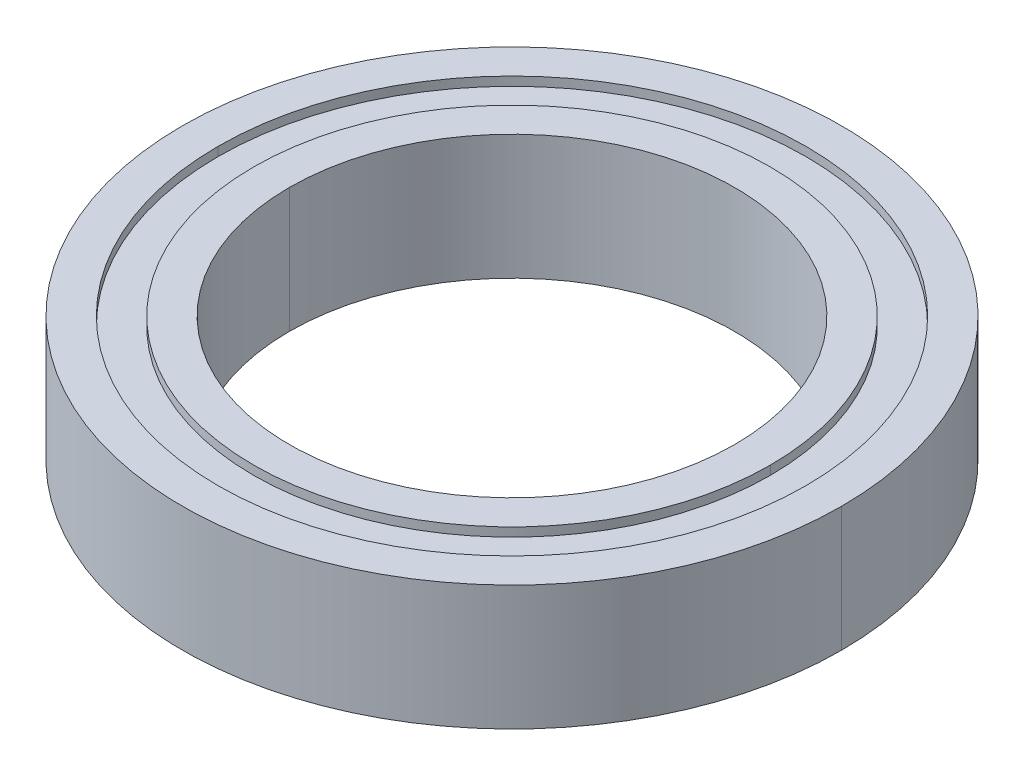
ISO-10303-21;
HEADER;
FILE_DESCRIPTION(('STEP AP214'),'2;1');
FILE_NAME('part.step','',(''),(''),'','','');
FILE_SCHEMA(('AUTOMOTIVE_DESIGN { 1 0 10303 214 1 1 1 1 }'));
ENDSEC;
DATA;
#1=APPLICATION_CONTEXT('core data for automotive mechanical design processes');
#2=APPLICATION_PROTOCOL_DEFINITION('international standard','automotive_design',2000,#1);
#3=PRODUCT_CONTEXT('',#1,'mechanical');
#4=PRODUCT('Part','Part','',(#3));
#5=PRODUCT_RELATED_PRODUCT_CATEGORY('part','',(#4));
#6=PRODUCT_DEFINITION_FORMATION('','',#4);
#7=PRODUCT_DEFINITION_CONTEXT('part definition',#1,'design');
#8=PRODUCT_DEFINITION('design','',#6,#7);
#9=PRODUCT_DEFINITION_SHAPE('','',#8);
#10=(LENGTH_UNIT() NAMED_UNIT(*) SI_UNIT(.MILLI.,.METRE.));
#11=(NAMED_UNIT(*) PLANE_ANGLE_UNIT() SI_UNIT($,.RADIAN.));
#12=(NAMED_UNIT(*) SI_UNIT($,.STERADIAN.) SOLID_ANGLE_UNIT());
#13=UNCERTAINTY_MEASURE_WITH_UNIT(LENGTH_MEASURE(1.E-05),#10,'distance_accuracy_value','');
#14=(GEOMETRIC_REPRESENTATION_CONTEXT(3) GLOBAL_UNCERTAINTY_ASSIGNED_CONTEXT((#13)) GLOBAL_UNIT_ASSIGNED_CONTEXT((#10,
#11,#12)) REPRESENTATION_CONTEXT('',''));
#15=CARTESIAN_POINT('',(0.,0.,0.));
#16=DIRECTION('',(0.,0.,1.));
#17=DIRECTION('',(1.,0.,0.));
#18=AXIS2_PLACEMENT_3D('',#15,#16,#17);
#19=CARTESIAN_POINT('',(13.5,0.,0.));
#20=DIRECTION('',(0.,-1.,0.));
#21=DIRECTION('',(0.,0.,-1.));
#22=AXIS2_PLACEMENT_3D('',#19,#20,#21);
#23=PLANE('',#22);
#24=CARTESIAN_POINT('',(0.,0.,0.));
#25=DIRECTION('',(0.,-1.,0.));
#26=DIRECTION('',(1.,0.,0.));
#27=AXIS2_PLACEMENT_3D('',#24,#25,#26);
#28=CIRCLE('',#27,12.5);
#29=CARTESIAN_POINT('',(12.5,0.,0.));
#30=VERTEX_POINT('',#29);
#31=CARTESIAN_POINT('',(-12.5,0.,0.));
#32=VERTEX_POINT('',#31);
#33=EDGE_CURVE('E40',#30,#32,#28,.T.);
#34=ORIENTED_EDGE('',*,*,#33,.F.);
#35=CARTESIAN_POINT('',(0.,0.,0.));
#36=DIRECTION('',(0.,-1.,0.));
#37=DIRECTION('',(1.,0.,0.));
#38=AXIS2_PLACEMENT_3D('',#35,#36,#37);
#39=CIRCLE('',#38,12.5);
#40=EDGE_CURVE('E199',#32,#30,#39,.T.);
#41=ORIENTED_EDGE('',*,*,#40,.F.);
#42=EDGE_LOOP('',(#34,#41));
#43=FACE_BOUND('',#42,.T.);
#44=CARTESIAN_POINT('',(0.,0.,0.));
#45=DIRECTION('',(0.,-1.,0.));
#46=DIRECTION('',(1.,0.,0.));
#47=AXIS2_PLACEMENT_3D('',#44,#45,#46);
#48=CIRCLE('',#47,14.5);
#49=CARTESIAN_POINT('',(14.5,0.,0.));
#50=VERTEX_POINT('',#49);
#51=CARTESIAN_POINT('',(-14.5,0.,0.));
#52=VERTEX_POINT('',#51);
#53=EDGE_CURVE('E151',#50,#52,#48,.T.);
#54=ORIENTED_EDGE('',*,*,#53,.T.);
#55=CARTESIAN_POINT('',(0.,0.,0.));
#56=DIRECTION('',(0.,-1.,0.));
#57=DIRECTION('',(1.,0.,0.));
#58=AXIS2_PLACEMENT_3D('',#55,#56,#57);
#59=CIRCLE('',#58,14.5);
#60=EDGE_CURVE('E11',#52,#50,#59,.T.);
#61=ORIENTED_EDGE('',*,*,#60,.T.);
#62=EDGE_LOOP('',(#54,#61));
#63=FACE_BOUND('',#62,.T.);
#64=ADVANCED_FACE('F16',(#43,#63),#23,.T.);
#65=CARTESIAN_POINT('',(0.,0.25,0.));
#66=DIRECTION('',(0.,-1.,0.));
#67=DIRECTION('',(1.,0.,0.));
#68=AXIS2_PLACEMENT_3D('',#65,#66,#67);
#69=CYLINDRICAL_SURFACE('',#68,14.5);
#70=DIRECTION('',(0.,-1.,0.));
#71=VECTOR('',#70,1.);
#72=CARTESIAN_POINT('',(14.5,0.25,0.));
#73=LINE('',#72,#71);
#74=CARTESIAN_POINT('',(14.5,0.5,0.));
#75=VERTEX_POINT('',#74);
#76=EDGE_CURVE('E191',#75,#50,#73,.T.);
#77=ORIENTED_EDGE('',*,*,#76,.T.);
#78=ORIENTED_EDGE('',*,*,#60,.F.);
#79=DIRECTION('',(0.,1.,0.));
#80=VECTOR('',#79,1.);
#81=CARTESIAN_POINT('',(-14.5,0.25,0.));
#82=LINE('',#81,#80);
#83=CARTESIAN_POINT('',(-14.5,0.5,0.));
#84=VERTEX_POINT('',#83);
#85=EDGE_CURVE('E158',#52,#84,#82,.T.);
#86=ORIENTED_EDGE('',*,*,#85,.T.);
#87=CARTESIAN_POINT('',(0.,0.5,0.));
#88=DIRECTION('',(0.,-1.,0.));
#89=DIRECTION('',(1.,0.,0.));
#90=AXIS2_PLACEMENT_3D('',#87,#88,#89);
#91=CIRCLE('',#90,14.5);
#92=EDGE_CURVE('E20',#84,#75,#91,.T.);
#93=ORIENTED_EDGE('',*,*,#92,.T.);
#94=EDGE_LOOP('',(#77,#78,#86,#93));
#95=FACE_BOUND('',#94,.T.);
#96=ADVANCED_FACE('F432',(#95),#69,.T.);
#97=CARTESIAN_POINT('',(15.5,0.5,0.));
#98=DIRECTION('',(0.,-1.,0.));
#99=DIRECTION('',(0.,0.,-1.));
#100=AXIS2_PLACEMENT_3D('',#97,#98,#99);
#101=PLANE('',#100);
#102=CARTESIAN_POINT('',(0.,0.5,0.));
#103=DIRECTION('',(0.,-1.,0.));
#104=DIRECTION('',(1.,0.,0.));
#105=AXIS2_PLACEMENT_3D('',#102,#103,#104);
#106=CIRCLE('',#105,14.5);
#107=EDGE_CURVE('E188',#75,#84,#106,.T.);
#108=ORIENTED_EDGE('',*,*,#107,.F.);
#109=ORIENTED_EDGE('',*,*,#92,.F.);
#110=EDGE_LOOP('',(#108,#109));
#111=FACE_BOUND('',#110,.T.);
#112=CARTESIAN_POINT('',(0.,0.5,0.));
#113=DIRECTION('',(0.,-1.,0.));
#114=DIRECTION('',(1.,0.,0.));
#115=AXIS2_PLACEMENT_3D('',#112,#113,#114);
#116=CIRCLE('',#115,16.5);
#117=CARTESIAN_POINT('',(16.5,0.5,0.));
#118=VERTEX_POINT('',#117);
#119=CARTESIAN_POINT('',(-16.5,0.5,0.));
#120=VERTEX_POINT('',#119);
#121=EDGE_CURVE('E130',#118,#120,#116,.T.);
#122=ORIENTED_EDGE('',*,*,#121,.T.);
#123=CARTESIAN_POINT('',(0.,0.5,0.));
#124=DIRECTION('',(0.,-1.,0.));
#125=DIRECTION('',(1.,0.,0.));
#126=AXIS2_PLACEMENT_3D('',#123,#124,#125);
#127=CIRCLE('',#126,16.5);
#128=EDGE_CURVE('E142',#120,#118,#127,.T.);
#129=ORIENTED_EDGE('',*,*,#128,.T.);
#130=EDGE_LOOP('',(#122,#129));
#131=FACE_BOUND('',#130,.T.);
#132=ADVANCED_FACE('F18',(#111,#131),#101,.T.);
#133=CARTESIAN_POINT('',(0.,0.25,0.));
#134=DIRECTION('',(0.,-1.,0.));
#135=DIRECTION('',(1.,0.,0.));
#136=AXIS2_PLACEMENT_3D('',#133,#134,#135);
#137=CYLINDRICAL_SURFACE('',#136,16.5);
#138=DIRECTION('',(0.,-1.,0.));
#139=VECTOR('',#138,1.);
#140=CARTESIAN_POINT('',(16.5,0.25,0.));
#141=LINE('',#140,#139);
#142=CARTESIAN_POINT('',(16.5,0.,0.));
#143=VERTEX_POINT('',#142);
#144=EDGE_CURVE('E134',#118,#143,#141,.T.);
#145=ORIENTED_EDGE('',*,*,#144,.T.);
#146=CARTESIAN_POINT('',(0.,0.,0.));
#147=DIRECTION('',(0.,-1.,0.));
#148=DIRECTION('',(1.,0.,0.));
#149=AXIS2_PLACEMENT_3D('',#146,#147,#148);
#150=CIRCLE('',#149,16.5);
#151=CARTESIAN_POINT('',(-16.5,0.,0.));
#152=VERTEX_POINT('',#151);
#153=EDGE_CURVE('E140',#143,#152,#150,.T.);
#154=ORIENTED_EDGE('',*,*,#153,.T.);
#155=DIRECTION('',(0.,1.,0.));
#156=VECTOR('',#155,1.);
#157=CARTESIAN_POINT('',(-16.5,0.25,0.));
#158=LINE('',#157,#156);
#159=EDGE_CURVE('E136',#152,#120,#158,.T.);
#160=ORIENTED_EDGE('',*,*,#159,.T.);
#161=ORIENTED_EDGE('',*,*,#121,.F.);
#162=EDGE_LOOP('',(#145,#154,#160,#161));
#163=FACE_BOUND('',#162,.T.);
#164=ADVANCED_FACE('F132',(#163),#137,.F.);
#165=CARTESIAN_POINT('',(17.5,0.,0.));
#166=DIRECTION('',(0.,-1.,0.));
#167=DIRECTION('',(0.,0.,-1.));
#168=AXIS2_PLACEMENT_3D('',#165,#166,#167);
#169=PLANE('',#168);
#170=ORIENTED_EDGE('',*,*,#153,.F.);
#171=CARTESIAN_POINT('',(0.,0.,0.));
#172=DIRECTION('',(0.,-1.,0.));
#173=DIRECTION('',(1.,0.,0.));
#174=AXIS2_PLACEMENT_3D('',#171,#172,#173);
#175=CIRCLE('',#174,16.5);
#176=EDGE_CURVE('E149',#152,#143,#175,.T.);
#177=ORIENTED_EDGE('',*,*,#176,.F.);
#178=EDGE_LOOP('',(#170,#177));
#179=FACE_BOUND('',#178,.T.);
#180=CARTESIAN_POINT('',(0.,0.,0.));
#181=DIRECTION('',(0.,-1.,0.));
#182=DIRECTION('',(1.,0.,0.));
#183=AXIS2_PLACEMENT_3D('',#180,#181,#182);
#184=CIRCLE('',#183,18.5);
#185=CARTESIAN_POINT('',(18.5,0.,0.));
#186=VERTEX_POINT('',#185);
#187=CARTESIAN_POINT('',(-18.5,0.,0.));
#188=VERTEX_POINT('',#187);
#189=EDGE_CURVE('E247',#186,#188,#184,.T.);
#190=ORIENTED_EDGE('',*,*,#189,.T.);
#191=CARTESIAN_POINT('',(0.,0.,0.));
#192=DIRECTION('',(0.,-1.,0.));
#193=DIRECTION('',(1.,0.,0.));
#194=AXIS2_PLACEMENT_3D('',#191,#192,#193);
#195=CIRCLE('',#194,18.5);
#196=EDGE_CURVE('E195',#188,#186,#195,.T.);
#197=ORIENTED_EDGE('',*,*,#196,.T.);
#198=EDGE_LOOP('',(#190,#197));
#199=FACE_BOUND('',#198,.T.);
#200=ADVANCED_FACE('F400',(#179,#199),#169,.T.);
#201=CARTESIAN_POINT('',(0.,3.5,0.));
#202=DIRECTION('',(0.,-1.,0.));
#203=DIRECTION('',(1.,0.,0.));
#204=AXIS2_PLACEMENT_3D('',#201,#202,#203);
#205=CYLINDRICAL_SURFACE('',#204,18.5);
#206=DIRECTION('',(0.,-1.,0.));
#207=VECTOR('',#206,1.);
#208=CARTESIAN_POINT('',(18.5,3.5,0.));
#209=LINE('',#208,#207);
#210=CARTESIAN_POINT('',(18.5,7.,0.));
#211=VERTEX_POINT('',#210);
#212=EDGE_CURVE('E183',#211,#186,#209,.T.);
#213=ORIENTED_EDGE('',*,*,#212,.T.);
#214=ORIENTED_EDGE('',*,*,#196,.F.);
#215=DIRECTION('',(0.,1.,0.));
#216=VECTOR('',#215,1.);
#217=CARTESIAN_POINT('',(-18.5,3.5,0.));
#218=LINE('',#217,#216);
#219=CARTESIAN_POINT('',(-18.5,7.,0.));
#220=VERTEX_POINT('',#219);
#221=EDGE_CURVE('E253',#188,#220,#218,.T.);
#222=ORIENTED_EDGE('',*,*,#221,.T.);
#223=CARTESIAN_POINT('',(0.,7.,0.));
#224=DIRECTION('',(0.,-1.,0.));
#225=DIRECTION('',(1.,0.,0.));
#226=AXIS2_PLACEMENT_3D('',#223,#224,#225);
#227=CIRCLE('',#226,18.5);
#228=EDGE_CURVE('E218',#220,#211,#227,.T.);
#229=ORIENTED_EDGE('',*,*,#228,.T.);
#230=EDGE_LOOP('',(#213,#214,#222,#229));
#231=FACE_BOUND('',#230,.T.);
#232=ADVANCED_FACE('F395',(#231),#205,.T.);
#233=CARTESIAN_POINT('',(17.5,7.,0.));
#234=DIRECTION('',(0.,1.,0.));
#235=DIRECTION('',(1.,0.,0.));
#236=AXIS2_PLACEMENT_3D('',#233,#234,#235);
#237=PLANE('',#236);
#238=CARTESIAN_POINT('',(0.,7.,0.));
#239=DIRECTION('',(0.,-1.,0.));
#240=DIRECTION('',(1.,0.,0.));
#241=AXIS2_PLACEMENT_3D('',#238,#239,#240);
#242=CIRCLE('',#241,16.5);
#243=CARTESIAN_POINT('',(16.5,7.,0.));
#244=VERTEX_POINT('',#243);
#245=CARTESIAN_POINT('',(-16.5,7.,0.));
#246=VERTEX_POINT('',#245);
#247=EDGE_CURVE('E182',#244,#246,#242,.T.);
#248=ORIENTED_EDGE('',*,*,#247,.T.);
#249=CARTESIAN_POINT('',(0.,7.,0.));
#250=DIRECTION('',(0.,-1.,0.));
#251=DIRECTION('',(1.,0.,0.));
#252=AXIS2_PLACEMENT_3D('',#249,#250,#251);
#253=CIRCLE('',#252,16.5);
#254=EDGE_CURVE('E208',#246,#244,#253,.T.);
#255=ORIENTED_EDGE('',*,*,#254,.T.);
#256=EDGE_LOOP('',(#248,#255));
#257=FACE_BOUND('',#256,.T.);
#258=CARTESIAN_POINT('',(0.,7.,0.));
#259=DIRECTION('',(0.,-1.,0.));
#260=DIRECTION('',(1.,0.,0.));
#261=AXIS2_PLACEMENT_3D('',#258,#259,#260);
#262=CIRCLE('',#261,18.5);
#263=EDGE_CURVE('E187',#211,#220,#262,.T.);
#264=ORIENTED_EDGE('',*,*,#263,.F.);
#265=ORIENTED_EDGE('',*,*,#228,.F.);
#266=EDGE_LOOP('',(#264,#265));
#267=FACE_BOUND('',#266,.T.);
#268=ADVANCED_FACE('F387',(#257,#267),#237,.T.);
#269=CARTESIAN_POINT('',(0.,6.75,0.));
#270=DIRECTION('',(0.,-1.,0.));
#271=DIRECTION('',(1.,0.,0.));
#272=AXIS2_PLACEMENT_3D('',#269,#270,#271);
#273=CYLINDRICAL_SURFACE('',#272,16.5);
#274=DIRECTION('',(0.,-1.,0.));
#275=VECTOR('',#274,1.);
#276=CARTESIAN_POINT('',(16.5,6.75,0.));
#277=LINE('',#276,#275);
#278=CARTESIAN_POINT('',(16.5,6.5,0.));
#279=VERTEX_POINT('',#278);
#280=EDGE_CURVE('E243',#244,#279,#277,.T.);
#281=ORIENTED_EDGE('',*,*,#280,.T.);
#282=CARTESIAN_POINT('',(0.,6.5,0.));
#283=DIRECTION('',(0.,-1.,0.));
#284=DIRECTION('',(1.,0.,0.));
#285=AXIS2_PLACEMENT_3D('',#282,#283,#284);
#286=CIRCLE('',#285,16.5);
#287=CARTESIAN_POINT('',(-16.5,6.5,0.));
#288=VERTEX_POINT('',#287);
#289=EDGE_CURVE('E171',#279,#288,#286,.T.);
#290=ORIENTED_EDGE('',*,*,#289,.T.);
#291=DIRECTION('',(0.,1.,0.));
#292=VECTOR('',#291,1.);
#293=CARTESIAN_POINT('',(-16.5,6.75,0.));
#294=LINE('',#293,#292);
#295=EDGE_CURVE('E204',#288,#246,#294,.T.);
#296=ORIENTED_EDGE('',*,*,#295,.T.);
#297=ORIENTED_EDGE('',*,*,#247,.F.);
#298=EDGE_LOOP('',(#281,#290,#296,#297));
#299=FACE_BOUND('',#298,.T.);
#300=ADVANCED_FACE('F363',(#299),#273,.F.);
#301=CARTESIAN_POINT('',(15.5,6.5,0.));
#302=DIRECTION('',(0.,1.,0.));
#303=DIRECTION('',(1.,0.,0.));
#304=AXIS2_PLACEMENT_3D('',#301,#302,#303);
#305=PLANE('',#304);
#306=CARTESIAN_POINT('',(0.,6.5,0.));
#307=DIRECTION('',(0.,-1.,0.));
#308=DIRECTION('',(1.,0.,0.));
#309=AXIS2_PLACEMENT_3D('',#306,#307,#308);
#310=CIRCLE('',#309,14.5);
#311=CARTESIAN_POINT('',(14.5,6.5,0.));
#312=VERTEX_POINT('',#311);
#313=CARTESIAN_POINT('',(-14.5,6.5,0.));
#314=VERTEX_POINT('',#313);
#315=EDGE_CURVE('E167',#312,#314,#310,.T.);
#316=ORIENTED_EDGE('',*,*,#315,.T.);
#317=CARTESIAN_POINT('',(0.,6.5,0.));
#318=DIRECTION('',(0.,-1.,0.));
#319=DIRECTION('',(1.,0.,0.));
#320=AXIS2_PLACEMENT_3D('',#317,#318,#319);
#321=CIRCLE('',#320,14.5);
#322=EDGE_CURVE('E168',#314,#312,#321,.T.);
#323=ORIENTED_EDGE('',*,*,#322,.T.);
#324=EDGE_LOOP('',(#316,#323));
#325=FACE_BOUND('',#324,.T.);
#326=ORIENTED_EDGE('',*,*,#289,.F.);
#327=CARTESIAN_POINT('',(0.,6.5,0.));
#328=DIRECTION('',(0.,-1.,0.));
#329=DIRECTION('',(1.,0.,0.));
#330=AXIS2_PLACEMENT_3D('',#327,#328,#329);
#331=CIRCLE('',#330,16.5);
#332=EDGE_CURVE('E177',#288,#279,#331,.T.);
#333=ORIENTED_EDGE('',*,*,#332,.F.);
#334=EDGE_LOOP('',(#326,#333));
#335=FACE_BOUND('',#334,.T.);
#336=ADVANCED_FACE('F357',(#325,#335),#305,.T.);
#337=CARTESIAN_POINT('',(0.,6.75,0.));
#338=DIRECTION('',(0.,-1.,0.));
#339=DIRECTION('',(1.,0.,0.));
#340=AXIS2_PLACEMENT_3D('',#337,#338,#339);
#341=CYLINDRICAL_SURFACE('',#340,14.5);
#342=DIRECTION('',(0.,-1.,0.));
#343=VECTOR('',#342,1.);
#344=CARTESIAN_POINT('',(14.5,6.75,0.));
#345=LINE('',#344,#343);
#346=CARTESIAN_POINT('',(14.5,7.,0.));
#347=VERTEX_POINT('',#346);
#348=EDGE_CURVE('E173',#347,#312,#345,.T.);
#349=ORIENTED_EDGE('',*,*,#348,.T.);
#350=ORIENTED_EDGE('',*,*,#322,.F.);
#351=DIRECTION('',(0.,1.,0.));
#352=VECTOR('',#351,1.);
#353=CARTESIAN_POINT('',(-14.5,6.75,0.));
#354=LINE('',#353,#352);
#355=CARTESIAN_POINT('',(-14.5,7.,0.));
#356=VERTEX_POINT('',#355);
#357=EDGE_CURVE('E212',#314,#356,#354,.T.);
#358=ORIENTED_EDGE('',*,*,#357,.T.);
#359=CARTESIAN_POINT('',(0.,7.,0.));
#360=DIRECTION('',(0.,-1.,0.));
#361=DIRECTION('',(1.,0.,0.));
#362=AXIS2_PLACEMENT_3D('',#359,#360,#361);
#363=CIRCLE('',#362,14.5);
#364=EDGE_CURVE('E172',#356,#347,#363,.T.);
#365=ORIENTED_EDGE('',*,*,#364,.T.);
#366=EDGE_LOOP('',(#349,#350,#358,#365));
#367=FACE_BOUND('',#366,.T.);
#368=ADVANCED_FACE('F362',(#367),#341,.T.);
#369=CARTESIAN_POINT('',(13.5,7.,0.));
#370=DIRECTION('',(0.,1.,0.));
#371=DIRECTION('',(1.,0.,0.));
#372=AXIS2_PLACEMENT_3D('',#369,#370,#371);
#373=PLANE('',#372);
#374=CARTESIAN_POINT('',(0.,7.,0.));
#375=DIRECTION('',(0.,-1.,0.));
#376=DIRECTION('',(1.,0.,0.));
#377=AXIS2_PLACEMENT_3D('',#374,#375,#376);
#378=CIRCLE('',#377,12.5);
#379=CARTESIAN_POINT('',(12.5,7.,0.));
#380=VERTEX_POINT('',#379);
#381=CARTESIAN_POINT('',(-12.5,7.,0.));
#382=VERTEX_POINT('',#381);
#383=EDGE_CURVE('E240',#380,#382,#378,.T.);
#384=ORIENTED_EDGE('',*,*,#383,.T.);
#385=CARTESIAN_POINT('',(0.,7.,0.));
#386=DIRECTION('',(0.,-1.,0.));
#387=DIRECTION('',(1.,0.,0.));
#388=AXIS2_PLACEMENT_3D('',#385,#386,#387);
#389=CIRCLE('',#388,12.5);
#390=EDGE_CURVE('E166',#382,#380,#389,.T.);
#391=ORIENTED_EDGE('',*,*,#390,.T.);
#392=EDGE_LOOP('',(#384,#391));
#393=FACE_BOUND('',#392,.T.);
#394=CARTESIAN_POINT('',(0.,7.,0.));
#395=DIRECTION('',(0.,-1.,0.));
#396=DIRECTION('',(1.,0.,0.));
#397=AXIS2_PLACEMENT_3D('',#394,#395,#396);
#398=CIRCLE('',#397,14.5);
#399=EDGE_CURVE('E176',#347,#356,#398,.T.);
#400=ORIENTED_EDGE('',*,*,#399,.F.);
#401=ORIENTED_EDGE('',*,*,#364,.F.);
#402=EDGE_LOOP('',(#400,#401));
#403=FACE_BOUND('',#402,.T.);
#404=ADVANCED_FACE('F454',(#393,#403),#373,.T.);
#405=CARTESIAN_POINT('',(0.,3.5,0.));
#406=DIRECTION('',(0.,-1.,0.));
#407=DIRECTION('',(1.,0.,0.));
#408=AXIS2_PLACEMENT_3D('',#405,#406,#407);
#409=CYLINDRICAL_SURFACE('',#408,12.5);
#410=DIRECTION('',(0.,-1.,0.));
#411=VECTOR('',#410,1.);
#412=CARTESIAN_POINT('',(12.5,3.5,0.));
#413=LINE('',#412,#411);
#414=EDGE_CURVE('E163',#380,#30,#413,.T.);
#415=ORIENTED_EDGE('',*,*,#414,.T.);
#416=ORIENTED_EDGE('',*,*,#33,.T.);
#417=DIRECTION('',(0.,1.,0.));
#418=VECTOR('',#417,1.);
#419=CARTESIAN_POINT('',(-12.5,3.5,0.));
#420=LINE('',#419,#418);
#421=EDGE_CURVE('E202',#32,#382,#420,.T.);
#422=ORIENTED_EDGE('',*,*,#421,.T.);
#423=ORIENTED_EDGE('',*,*,#383,.F.);
#424=EDGE_LOOP('',(#415,#416,#422,#423));
#425=FACE_BOUND('',#424,.T.);
#426=ADVANCED_FACE('F449',(#425),#409,.F.);
#427=CARTESIAN_POINT('',(0.,3.5,0.));
#428=DIRECTION('',(0.,-1.,0.));
#429=DIRECTION('',(1.,0.,0.));
#430=AXIS2_PLACEMENT_3D('',#427,#428,#429);
#431=CYLINDRICAL_SURFACE('',#430,12.5);
#432=ORIENTED_EDGE('',*,*,#414,.F.);
#433=ORIENTED_EDGE('',*,*,#390,.F.);
#434=ORIENTED_EDGE('',*,*,#421,.F.);
#435=ORIENTED_EDGE('',*,*,#40,.T.);
#436=EDGE_LOOP('',(#432,#433,#434,#435));
#437=FACE_BOUND('',#436,.T.);
#438=ADVANCED_FACE('F347',(#437),#431,.F.);
#439=CARTESIAN_POINT('',(0.,6.75,0.));
#440=DIRECTION('',(0.,-1.,0.));
#441=DIRECTION('',(1.,0.,0.));
#442=AXIS2_PLACEMENT_3D('',#439,#440,#441);
#443=CYLINDRICAL_SURFACE('',#442,14.5);
#444=ORIENTED_EDGE('',*,*,#348,.F.);
#445=ORIENTED_EDGE('',*,*,#399,.T.);
#446=ORIENTED_EDGE('',*,*,#357,.F.);
#447=ORIENTED_EDGE('',*,*,#315,.F.);
#448=EDGE_LOOP('',(#444,#445,#446,#447));
#449=FACE_BOUND('',#448,.T.);
#450=ADVANCED_FACE('F340',(#449),#443,.T.);
#451=CARTESIAN_POINT('',(0.,6.75,0.));
#452=DIRECTION('',(0.,-1.,0.));
#453=DIRECTION('',(1.,0.,0.));
#454=AXIS2_PLACEMENT_3D('',#451,#452,#453);
#455=CYLINDRICAL_SURFACE('',#454,16.5);
#456=ORIENTED_EDGE('',*,*,#280,.F.);
#457=ORIENTED_EDGE('',*,*,#254,.F.);
#458=ORIENTED_EDGE('',*,*,#295,.F.);
#459=ORIENTED_EDGE('',*,*,#332,.T.);
#460=EDGE_LOOP('',(#456,#457,#458,#459));
#461=FACE_BOUND('',#460,.T.);
#462=ADVANCED_FACE('F346',(#461),#455,.F.);
#463=CARTESIAN_POINT('',(0.,3.5,0.));
#464=DIRECTION('',(0.,-1.,0.));
#465=DIRECTION('',(1.,0.,0.));
#466=AXIS2_PLACEMENT_3D('',#463,#464,#465);
#467=CYLINDRICAL_SURFACE('',#466,18.5);
#468=ORIENTED_EDGE('',*,*,#212,.F.);
#469=ORIENTED_EDGE('',*,*,#263,.T.);
#470=ORIENTED_EDGE('',*,*,#221,.F.);
#471=ORIENTED_EDGE('',*,*,#189,.F.);
#472=EDGE_LOOP('',(#468,#469,#470,#471));
#473=FACE_BOUND('',#472,.T.);
#474=ADVANCED_FACE('F407',(#473),#467,.T.);
#475=CARTESIAN_POINT('',(0.,0.25,0.));
#476=DIRECTION('',(0.,-1.,0.));
#477=DIRECTION('',(1.,0.,0.));
#478=AXIS2_PLACEMENT_3D('',#475,#476,#477);
#479=CYLINDRICAL_SURFACE('',#478,16.5);
#480=ORIENTED_EDGE('',*,*,#144,.F.);
#481=ORIENTED_EDGE('',*,*,#128,.F.);
#482=ORIENTED_EDGE('',*,*,#159,.F.);
#483=ORIENTED_EDGE('',*,*,#176,.T.);
#484=EDGE_LOOP('',(#480,#481,#482,#483));
#485=FACE_BOUND('',#484,.T.);
#486=ADVANCED_FACE('F147',(#485),#479,.F.);
#487=CARTESIAN_POINT('',(0.,0.25,0.));
#488=DIRECTION('',(0.,-1.,0.));
#489=DIRECTION('',(1.,0.,0.));
#490=AXIS2_PLACEMENT_3D('',#487,#488,#489);
#491=CYLINDRICAL_SURFACE('',#490,14.5);
#492=ORIENTED_EDGE('',*,*,#76,.F.);
#493=ORIENTED_EDGE('',*,*,#107,.T.);
#494=ORIENTED_EDGE('',*,*,#85,.F.);
#495=ORIENTED_EDGE('',*,*,#53,.F.);
#496=EDGE_LOOP('',(#492,#493,#494,#495));
#497=FACE_BOUND('',#496,.T.);
#498=ADVANCED_FACE('F372',(#497),#491,.T.);
#499=CLOSED_SHELL('',(#64,#96,#132,#164,#200,#232,#268,#300,#336,#368,#404,#426,#438,#450,#462,
#474,#486,#498));
#500=MANIFOLD_SOLID_BREP('B1',#499);
#501=ADVANCED_BREP_SHAPE_REPRESENTATION('',(#18,#500),#14);
#502=SHAPE_DEFINITION_REPRESENTATION(#9,#501);
ENDSEC;
END-ISO-10303-21;
